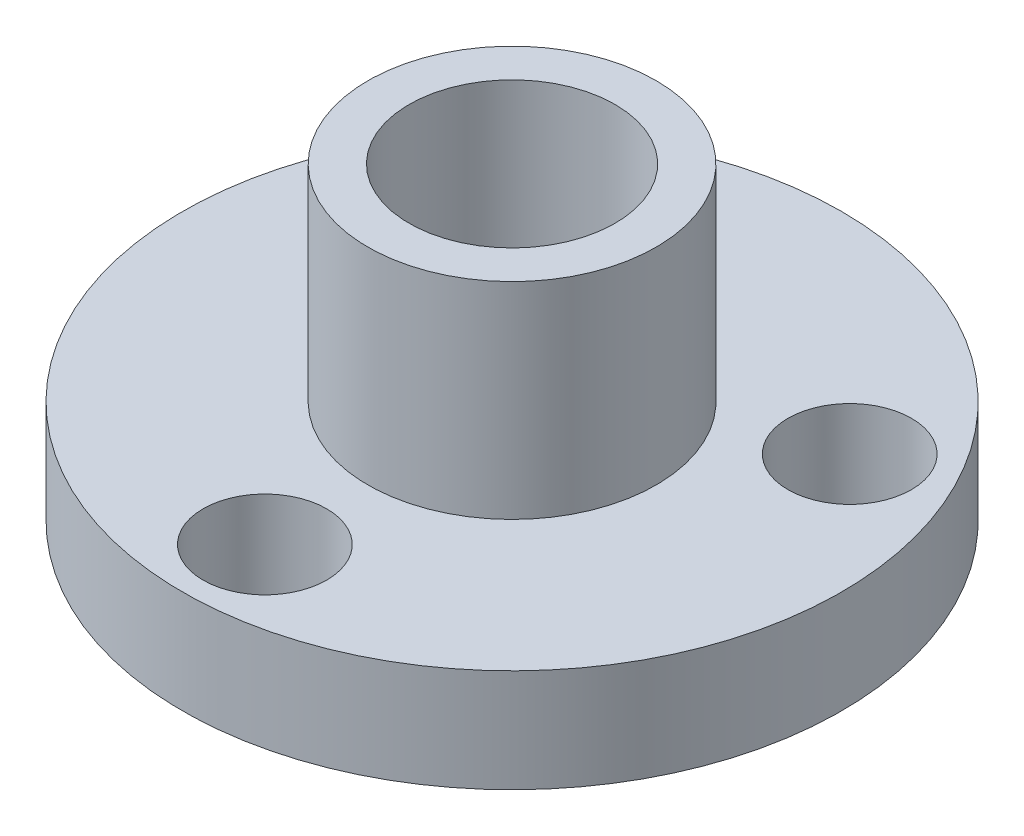
ISO-10303-21;
HEADER;
FILE_DESCRIPTION(('STEP AP214'),'2;1');
FILE_NAME('part.step','',(''),(''),'','','');
FILE_SCHEMA(('AUTOMOTIVE_DESIGN { 1 0 10303 214 1 1 1 1 }'));
ENDSEC;
DATA;
#1=APPLICATION_CONTEXT('core data for automotive mechanical design processes');
#2=APPLICATION_PROTOCOL_DEFINITION('international standard','automotive_design',2000,#1);
#3=PRODUCT_CONTEXT('',#1,'mechanical');
#4=PRODUCT('Part','Part','',(#3));
#5=PRODUCT_RELATED_PRODUCT_CATEGORY('part','',(#4));
#6=PRODUCT_DEFINITION_FORMATION('','',#4);
#7=PRODUCT_DEFINITION_CONTEXT('part definition',#1,'design');
#8=PRODUCT_DEFINITION('design','',#6,#7);
#9=PRODUCT_DEFINITION_SHAPE('','',#8);
#10=(LENGTH_UNIT() NAMED_UNIT(*) SI_UNIT(.MILLI.,.METRE.));
#11=(NAMED_UNIT(*) PLANE_ANGLE_UNIT() SI_UNIT($,.RADIAN.));
#12=(NAMED_UNIT(*) SI_UNIT($,.STERADIAN.) SOLID_ANGLE_UNIT());
#13=UNCERTAINTY_MEASURE_WITH_UNIT(LENGTH_MEASURE(1.E-05),#10,'distance_accuracy_value','');
#14=(GEOMETRIC_REPRESENTATION_CONTEXT(3) GLOBAL_UNCERTAINTY_ASSIGNED_CONTEXT((#13)) GLOBAL_UNIT_ASSIGNED_CONTEXT((#10,
#11,#12)) REPRESENTATION_CONTEXT('',''));
#15=CARTESIAN_POINT('',(0.,0.,0.));
#16=DIRECTION('',(0.,0.,1.));
#17=DIRECTION('',(1.,0.,0.));
#18=AXIS2_PLACEMENT_3D('',#15,#16,#17);
#19=CARTESIAN_POINT('',(0.,0.,0.));
#20=DIRECTION('',(0.,-1.,0.));
#21=DIRECTION('',(0.,0.,-1.));
#22=AXIS2_PLACEMENT_3D('',#19,#20,#21);
#23=CYLINDRICAL_SURFACE('',#22,2.5);
#24=CARTESIAN_POINT('',(0.,0.,0.));
#25=DIRECTION('',(0.,-1.,0.));
#26=DIRECTION('',(0.,0.,-1.));
#27=AXIS2_PLACEMENT_3D('',#24,#25,#26);
#28=CIRCLE('',#27,2.5);
#29=CARTESIAN_POINT('',(0.,0.,-2.5));
#30=VERTEX_POINT('',#29);
#31=EDGE_CURVE('E10',#30,#30,#28,.T.);
#32=ORIENTED_EDGE('',*,*,#31,.T.);
#33=EDGE_LOOP('',(#32));
#34=FACE_BOUND('',#33,.T.);
#35=CARTESIAN_POINT('',(0.,7.5,0.));
#36=DIRECTION('',(0.,-1.,0.));
#37=DIRECTION('',(0.,0.,-1.));
#38=AXIS2_PLACEMENT_3D('',#35,#36,#37);
#39=CIRCLE('',#38,2.5);
#40=CARTESIAN_POINT('',(0.,7.5,-2.5));
#41=VERTEX_POINT('',#40);
#42=EDGE_CURVE('E49',#41,#41,#39,.T.);
#43=ORIENTED_EDGE('',*,*,#42,.F.);
#44=EDGE_LOOP('',(#43));
#45=FACE_BOUND('',#44,.T.);
#46=ADVANCED_FACE('F31',(#34,#45),#23,.F.);
#47=CARTESIAN_POINT('',(2.5,0.,0.));
#48=DIRECTION('',(0.,-1.,0.));
#49=DIRECTION('',(0.,0.,-1.));
#50=AXIS2_PLACEMENT_3D('',#47,#48,#49);
#51=PLANE('',#50);
#52=CARTESIAN_POINT('',(5.19615242270663,0.,-3.));
#53=DIRECTION('',(0.,-1.,0.));
#54=DIRECTION('',(0.,0.,-1.));
#55=AXIS2_PLACEMENT_3D('',#52,#53,#54);
#56=CIRCLE('',#55,1.5);
#57=CARTESIAN_POINT('',(5.19615242270663,0.,-4.5));
#58=VERTEX_POINT('',#57);
#59=EDGE_CURVE('E53',#58,#58,#56,.T.);
#60=ORIENTED_EDGE('',*,*,#59,.F.);
#61=EDGE_LOOP('',(#60));
#62=FACE_BOUND('',#61,.T.);
#63=CARTESIAN_POINT('',(-5.19615242270663,0.,-3.));
#64=DIRECTION('',(0.,-1.,0.));
#65=DIRECTION('',(0.,0.,-1.));
#66=AXIS2_PLACEMENT_3D('',#63,#64,#65);
#67=CIRCLE('',#66,1.5);
#68=CARTESIAN_POINT('',(-5.19615242270663,0.,-4.5));
#69=VERTEX_POINT('',#68);
#70=EDGE_CURVE('E58',#69,#69,#67,.T.);
#71=ORIENTED_EDGE('',*,*,#70,.F.);
#72=EDGE_LOOP('',(#71));
#73=FACE_BOUND('',#72,.T.);
#74=CARTESIAN_POINT('',(0.,0.,6.));
#75=DIRECTION('',(0.,-1.,0.));
#76=DIRECTION('',(0.,0.,-1.));
#77=AXIS2_PLACEMENT_3D('',#74,#75,#76);
#78=CIRCLE('',#77,1.5);
#79=CARTESIAN_POINT('',(0.,0.,4.5));
#80=VERTEX_POINT('',#79);
#81=EDGE_CURVE('E50',#80,#80,#78,.T.);
#82=ORIENTED_EDGE('',*,*,#81,.F.);
#83=EDGE_LOOP('',(#82));
#84=FACE_BOUND('',#83,.T.);
#85=CARTESIAN_POINT('',(0.,0.,0.));
#86=DIRECTION('',(0.,-1.,0.));
#87=DIRECTION('',(0.,0.,-1.));
#88=AXIS2_PLACEMENT_3D('',#85,#86,#87);
#89=CIRCLE('',#88,8.);
#90=CARTESIAN_POINT('',(0.,0.,-8.));
#91=VERTEX_POINT('',#90);
#92=EDGE_CURVE('E38',#91,#91,#89,.T.);
#93=ORIENTED_EDGE('',*,*,#92,.T.);
#94=EDGE_LOOP('',(#93));
#95=FACE_BOUND('',#94,.T.);
#96=ORIENTED_EDGE('',*,*,#31,.F.);
#97=EDGE_LOOP('',(#96));
#98=FACE_BOUND('',#97,.T.);
#99=ADVANCED_FACE('F92',(#62,#73,#84,#95,#98),#51,.T.);
#100=CARTESIAN_POINT('',(0.,0.,0.));
#101=DIRECTION('',(0.,-1.,0.));
#102=DIRECTION('',(0.,0.,-1.));
#103=AXIS2_PLACEMENT_3D('',#100,#101,#102);
#104=CYLINDRICAL_SURFACE('',#103,8.);
#105=CARTESIAN_POINT('',(0.,2.5,0.));
#106=DIRECTION('',(0.,-1.,0.));
#107=DIRECTION('',(0.,0.,-1.));
#108=AXIS2_PLACEMENT_3D('',#105,#106,#107);
#109=CIRCLE('',#108,8.);
#110=CARTESIAN_POINT('',(0.,2.5,-8.));
#111=VERTEX_POINT('',#110);
#112=EDGE_CURVE('E43',#111,#111,#109,.T.);
#113=ORIENTED_EDGE('',*,*,#112,.T.);
#114=EDGE_LOOP('',(#113));
#115=FACE_BOUND('',#114,.T.);
#116=ORIENTED_EDGE('',*,*,#92,.F.);
#117=EDGE_LOOP('',(#116));
#118=FACE_BOUND('',#117,.T.);
#119=ADVANCED_FACE('F77',(#115,#118),#104,.T.);
#120=CARTESIAN_POINT('',(8.,2.5,0.));
#121=DIRECTION('',(0.,1.,0.));
#122=DIRECTION('',(0.,0.,1.));
#123=AXIS2_PLACEMENT_3D('',#120,#121,#122);
#124=PLANE('',#123);
#125=CARTESIAN_POINT('',(5.19615242270663,2.5,-3.));
#126=DIRECTION('',(0.,1.,0.));
#127=DIRECTION('',(0.,0.,1.));
#128=AXIS2_PLACEMENT_3D('',#125,#126,#127);
#129=CIRCLE('',#128,1.5);
#130=CARTESIAN_POINT('',(5.19615242270663,2.5,-1.5));
#131=VERTEX_POINT('',#130);
#132=EDGE_CURVE('E34',#131,#131,#129,.T.);
#133=ORIENTED_EDGE('',*,*,#132,.F.);
#134=EDGE_LOOP('',(#133));
#135=FACE_BOUND('',#134,.T.);
#136=CARTESIAN_POINT('',(-5.19615242270663,2.5,-3.));
#137=DIRECTION('',(0.,1.,0.));
#138=DIRECTION('',(0.,0.,1.));
#139=AXIS2_PLACEMENT_3D('',#136,#137,#138);
#140=CIRCLE('',#139,1.5);
#141=CARTESIAN_POINT('',(-5.19615242270663,2.5,-1.5));
#142=VERTEX_POINT('',#141);
#143=EDGE_CURVE('E51',#142,#142,#140,.T.);
#144=ORIENTED_EDGE('',*,*,#143,.F.);
#145=EDGE_LOOP('',(#144));
#146=FACE_BOUND('',#145,.T.);
#147=CARTESIAN_POINT('',(0.,2.5,6.));
#148=DIRECTION('',(0.,1.,0.));
#149=DIRECTION('',(0.,0.,1.));
#150=AXIS2_PLACEMENT_3D('',#147,#148,#149);
#151=CIRCLE('',#150,1.5);
#152=CARTESIAN_POINT('',(0.,2.5,7.5));
#153=VERTEX_POINT('',#152);
#154=EDGE_CURVE('E47',#153,#153,#151,.T.);
#155=ORIENTED_EDGE('',*,*,#154,.F.);
#156=EDGE_LOOP('',(#155));
#157=FACE_BOUND('',#156,.T.);
#158=CARTESIAN_POINT('',(0.,2.5,0.));
#159=DIRECTION('',(0.,-1.,0.));
#160=DIRECTION('',(0.,0.,-1.));
#161=AXIS2_PLACEMENT_3D('',#158,#159,#160);
#162=CIRCLE('',#161,3.5);
#163=CARTESIAN_POINT('',(0.,2.5,-3.5));
#164=VERTEX_POINT('',#163);
#165=EDGE_CURVE('E72',#164,#164,#162,.T.);
#166=ORIENTED_EDGE('',*,*,#165,.T.);
#167=EDGE_LOOP('',(#166));
#168=FACE_BOUND('',#167,.T.);
#169=ORIENTED_EDGE('',*,*,#112,.F.);
#170=EDGE_LOOP('',(#169));
#171=FACE_BOUND('',#170,.T.);
#172=ADVANCED_FACE('F80',(#135,#146,#157,#168,#171),#124,.T.);
#173=CARTESIAN_POINT('',(0.,0.,0.));
#174=DIRECTION('',(0.,-1.,0.));
#175=DIRECTION('',(0.,0.,-1.));
#176=AXIS2_PLACEMENT_3D('',#173,#174,#175);
#177=CYLINDRICAL_SURFACE('',#176,3.5);
#178=CARTESIAN_POINT('',(0.,7.5,0.));
#179=DIRECTION('',(0.,-1.,0.));
#180=DIRECTION('',(0.,0.,-1.));
#181=AXIS2_PLACEMENT_3D('',#178,#179,#180);
#182=CIRCLE('',#181,3.5);
#183=CARTESIAN_POINT('',(0.,7.5,-3.5));
#184=VERTEX_POINT('',#183);
#185=EDGE_CURVE('E69',#184,#184,#182,.T.);
#186=ORIENTED_EDGE('',*,*,#185,.T.);
#187=EDGE_LOOP('',(#186));
#188=FACE_BOUND('',#187,.T.);
#189=ORIENTED_EDGE('',*,*,#165,.F.);
#190=EDGE_LOOP('',(#189));
#191=FACE_BOUND('',#190,.T.);
#192=ADVANCED_FACE('F82',(#188,#191),#177,.T.);
#193=CARTESIAN_POINT('',(3.5,7.5,0.));
#194=DIRECTION('',(0.,1.,0.));
#195=DIRECTION('',(0.,0.,1.));
#196=AXIS2_PLACEMENT_3D('',#193,#194,#195);
#197=PLANE('',#196);
#198=ORIENTED_EDGE('',*,*,#42,.T.);
#199=EDGE_LOOP('',(#198));
#200=FACE_BOUND('',#199,.T.);
#201=ORIENTED_EDGE('',*,*,#185,.F.);
#202=EDGE_LOOP('',(#201));
#203=FACE_BOUND('',#202,.T.);
#204=ADVANCED_FACE('F89',(#200,#203),#197,.T.);
#205=CARTESIAN_POINT('',(0.,7.5,6.));
#206=DIRECTION('',(0.,-1.,0.));
#207=DIRECTION('',(0.,0.,-1.));
#208=AXIS2_PLACEMENT_3D('',#205,#206,#207);
#209=CYLINDRICAL_SURFACE('',#208,1.5);
#210=ORIENTED_EDGE('',*,*,#154,.T.);
#211=EDGE_LOOP('',(#210));
#212=FACE_BOUND('',#211,.T.);
#213=ORIENTED_EDGE('',*,*,#81,.T.);
#214=EDGE_LOOP('',(#213));
#215=FACE_BOUND('',#214,.T.);
#216=ADVANCED_FACE('F106',(#212,#215),#209,.F.);
#217=CARTESIAN_POINT('',(-5.19615242270663,7.5,-3.));
#218=DIRECTION('',(0.,-1.,0.));
#219=DIRECTION('',(0.,0.,-1.));
#220=AXIS2_PLACEMENT_3D('',#217,#218,#219);
#221=CYLINDRICAL_SURFACE('',#220,1.5);
#222=ORIENTED_EDGE('',*,*,#143,.T.);
#223=EDGE_LOOP('',(#222));
#224=FACE_BOUND('',#223,.T.);
#225=ORIENTED_EDGE('',*,*,#70,.T.);
#226=EDGE_LOOP('',(#225));
#227=FACE_BOUND('',#226,.T.);
#228=ADVANCED_FACE('F115',(#224,#227),#221,.F.);
#229=CARTESIAN_POINT('',(5.19615242270663,7.5,-3.));
#230=DIRECTION('',(0.,-1.,0.));
#231=DIRECTION('',(0.,0.,-1.));
#232=AXIS2_PLACEMENT_3D('',#229,#230,#231);
#233=CYLINDRICAL_SURFACE('',#232,1.5);
#234=ORIENTED_EDGE('',*,*,#132,.T.);
#235=EDGE_LOOP('',(#234));
#236=FACE_BOUND('',#235,.T.);
#237=ORIENTED_EDGE('',*,*,#59,.T.);
#238=EDGE_LOOP('',(#237));
#239=FACE_BOUND('',#238,.T.);
#240=ADVANCED_FACE('F121',(#236,#239),#233,.F.);
#241=CLOSED_SHELL('',(#46,#99,#119,#172,#192,#204,#216,#228,#240));
#242=MANIFOLD_SOLID_BREP('B2',#241);
#243=ADVANCED_BREP_SHAPE_REPRESENTATION('',(#18,#242),#14);
#244=SHAPE_DEFINITION_REPRESENTATION(#9,#243);
ENDSEC;
END-ISO-10303-21;
